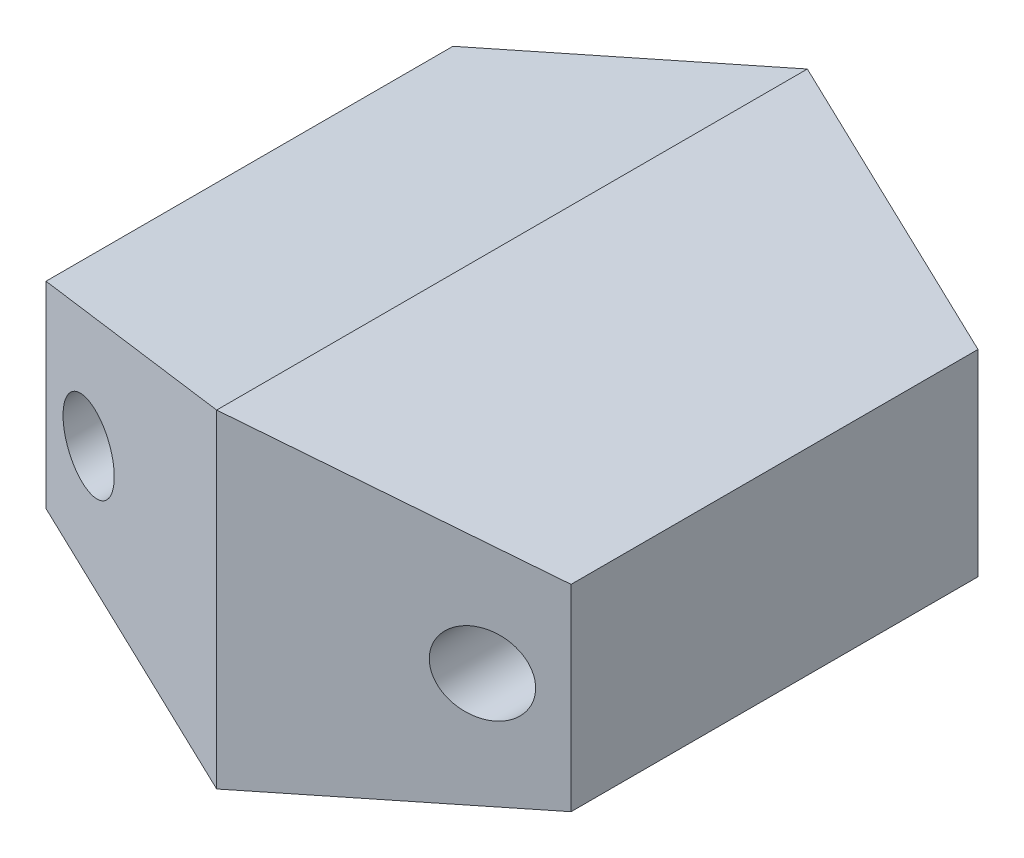
ISO-10303-21;
HEADER;
FILE_DESCRIPTION(('STEP AP214'),'2;1');
FILE_NAME('part.step','',(''),(''),'','','');
FILE_SCHEMA(('AUTOMOTIVE_DESIGN { 1 0 10303 214 1 1 1 1 }'));
ENDSEC;
DATA;
#1=APPLICATION_CONTEXT('core data for automotive mechanical design processes');
#2=APPLICATION_PROTOCOL_DEFINITION('international standard','automotive_design',2000,#1);
#3=PRODUCT_CONTEXT('',#1,'mechanical');
#4=PRODUCT('Part','Part','',(#3));
#5=PRODUCT_RELATED_PRODUCT_CATEGORY('part','',(#4));
#6=PRODUCT_DEFINITION_FORMATION('','',#4);
#7=PRODUCT_DEFINITION_CONTEXT('part definition',#1,'design');
#8=PRODUCT_DEFINITION('design','',#6,#7);
#9=PRODUCT_DEFINITION_SHAPE('','',#8);
#10=(LENGTH_UNIT() NAMED_UNIT(*) SI_UNIT(.MILLI.,.METRE.));
#11=(NAMED_UNIT(*) PLANE_ANGLE_UNIT() SI_UNIT($,.RADIAN.));
#12=(NAMED_UNIT(*) SI_UNIT($,.STERADIAN.) SOLID_ANGLE_UNIT());
#13=UNCERTAINTY_MEASURE_WITH_UNIT(LENGTH_MEASURE(1.E-05),#10,'distance_accuracy_value','');
#14=(GEOMETRIC_REPRESENTATION_CONTEXT(3) GLOBAL_UNCERTAINTY_ASSIGNED_CONTEXT((#13)) GLOBAL_UNIT_ASSIGNED_CONTEXT((#10,
#11,#12)) REPRESENTATION_CONTEXT('',''));
#15=CARTESIAN_POINT('',(0.,0.,0.));
#16=DIRECTION('',(0.,0.,1.));
#17=DIRECTION('',(1.,0.,0.));
#18=AXIS2_PLACEMENT_3D('',#15,#16,#17);
#19=CARTESIAN_POINT('',(20.,-12.5,45.));
#20=DIRECTION('',(-1.,0.,0.));
#21=DIRECTION('',(0.,0.,1.));
#22=AXIS2_PLACEMENT_3D('',#19,#20,#21);
#23=PLANE('',#22);
#24=DIRECTION('',(0.,0.,-1.));
#25=VECTOR('',#24,1.);
#26=CARTESIAN_POINT('',(20.0000000000001,7.4999999999998,45.));
#27=LINE('',#26,#25);
#28=CARTESIAN_POINT('',(20.0000000000001,7.4999999999998,38.));
#29=VERTEX_POINT('',#28);
#30=CARTESIAN_POINT('',(20.0000000000001,7.4999999999998,7.00000000000004));
#31=VERTEX_POINT('',#30);
#32=EDGE_CURVE('E147',#29,#31,#27,.T.);
#33=ORIENTED_EDGE('',*,*,#32,.F.);
#34=DIRECTION('',(0.,1.,0.));
#35=VECTOR('',#34,1.);
#36=CARTESIAN_POINT('',(20.,-32.5,38.));
#37=LINE('',#36,#35);
#38=CARTESIAN_POINT('',(20.0000000000001,-7.4999999999998,38.));
#39=VERTEX_POINT('',#38);
#40=EDGE_CURVE('E145',#39,#29,#37,.T.);
#41=ORIENTED_EDGE('',*,*,#40,.F.);
#42=DIRECTION('',(0.,0.,-1.));
#43=VECTOR('',#42,1.);
#44=CARTESIAN_POINT('',(20.0000000000001,-7.4999999999998,45.));
#45=LINE('',#44,#43);
#46=CARTESIAN_POINT('',(20.0000000000001,-7.4999999999998,7.00000000000004));
#47=VERTEX_POINT('',#46);
#48=EDGE_CURVE('E192',#39,#47,#45,.T.);
#49=ORIENTED_EDGE('',*,*,#48,.T.);
#50=DIRECTION('',(0.,1.,0.));
#51=VECTOR('',#50,1.);
#52=CARTESIAN_POINT('',(20.,-32.5,7.));
#53=LINE('',#52,#51);
#54=EDGE_CURVE('E216',#47,#31,#53,.T.);
#55=ORIENTED_EDGE('',*,*,#54,.T.);
#56=EDGE_LOOP('',(#33,#41,#49,#55));
#57=FACE_BOUND('',#56,.T.);
#58=ADVANCED_FACE('F74',(#57),#23,.F.);
#59=CARTESIAN_POINT('',(0.,-32.5,0.));
#60=DIRECTION('',(-0.330350424728106,0.,0.943858356366017));
#61=DIRECTION('',(0.943858356366017,0.,0.330350424728106));
#62=AXIS2_PLACEMENT_3D('',#59,#60,#61);
#63=PLANE('',#62);
#64=CARTESIAN_POINT('',(15.,0.,5.25000000000002));
#65=DIRECTION('',(-0.330350424728106,0.,0.943858356366017));
#66=DIRECTION('',(-0.943858356366018,0.,-0.330350424728106));
#67=AXIS2_PLACEMENT_3D('',#64,#65,#66);
#68=ELLIPSE('',#67,3.17844301506256,3.);
#69=CARTESIAN_POINT('',(12.,0.,4.20000000000002));
#70=VERTEX_POINT('',#69);
#71=EDGE_CURVE('E184',#70,#70,#68,.F.);
#72=ORIENTED_EDGE('',*,*,#71,.F.);
#73=EDGE_LOOP('',(#72));
#74=FACE_BOUND('',#73,.T.);
#75=DIRECTION('',(-0.918630424349249,0.229657606087321,-0.321520648522237));
#76=VECTOR('',#75,1.);
#77=CARTESIAN_POINT('',(9.49367088607626,10.1265822784809,3.32278481012669));
#78=LINE('',#77,#76);
#79=CARTESIAN_POINT('',(0.,12.5,0.));
#80=VERTEX_POINT('',#79);
#81=EDGE_CURVE('E99',#31,#80,#78,.T.);
#82=ORIENTED_EDGE('',*,*,#81,.F.);
#83=ORIENTED_EDGE('',*,*,#54,.F.);
#84=DIRECTION('',(-0.918630424349249,-0.229657606087321,-0.321520648522237));
#85=VECTOR('',#84,1.);
#86=CARTESIAN_POINT('',(-4.21940928270056,-13.5548523206752,-1.4767932489452));
#87=LINE('',#86,#85);
#88=CARTESIAN_POINT('',(0.,-12.5,0.));
#89=VERTEX_POINT('',#88);
#90=EDGE_CURVE('E203',#47,#89,#87,.T.);
#91=ORIENTED_EDGE('',*,*,#90,.T.);
#92=DIRECTION('',(0.,1.,0.));
#93=VECTOR('',#92,1.);
#94=CARTESIAN_POINT('',(0.,0.,0.));
#95=LINE('',#94,#93);
#96=EDGE_CURVE('E163',#89,#80,#95,.T.);
#97=ORIENTED_EDGE('',*,*,#96,.T.);
#98=EDGE_LOOP('',(#82,#83,#91,#97));
#99=FACE_BOUND('',#98,.T.);
#100=ADVANCED_FACE('F226',(#74,#99),#63,.F.);
#101=CARTESIAN_POINT('',(14.0311804008909,-32.5,40.0890868596882));
#102=DIRECTION('',(0.330350424728106,0.,0.943858356366017));
#103=DIRECTION('',(0.943858356366017,0.,-0.330350424728106));
#104=AXIS2_PLACEMENT_3D('',#101,#102,#103);
#105=PLANE('',#104);
#106=CARTESIAN_POINT('',(15.,0.,39.75));
#107=DIRECTION('',(0.330350424728106,0.,0.943858356366017));
#108=DIRECTION('',(0.943858356366018,0.,-0.330350424728106));
#109=AXIS2_PLACEMENT_3D('',#106,#107,#108);
#110=ELLIPSE('',#109,3.17844301506256,3.);
#111=CARTESIAN_POINT('',(18.,0.,38.7));
#112=VERTEX_POINT('',#111);
#113=EDGE_CURVE('E77',#112,#112,#110,.F.);
#114=ORIENTED_EDGE('',*,*,#113,.T.);
#115=EDGE_LOOP('',(#114));
#116=FACE_BOUND('',#115,.T.);
#117=ORIENTED_EDGE('',*,*,#40,.T.);
#118=DIRECTION('',(-0.918630424349249,0.229657606087321,0.321520648522237));
#119=VECTOR('',#118,1.);
#120=CARTESIAN_POINT('',(22.7848101265825,6.80379746835415,37.0253164556961));
#121=LINE('',#120,#119);
#122=CARTESIAN_POINT('',(0.,12.5,45.));
#123=VERTEX_POINT('',#122);
#124=EDGE_CURVE('E129',#29,#123,#121,.T.);
#125=ORIENTED_EDGE('',*,*,#124,.T.);
#126=DIRECTION('',(0.,-1.,0.));
#127=VECTOR('',#126,1.);
#128=CARTESIAN_POINT('',(0.,0.,45.));
#129=LINE('',#128,#127);
#130=CARTESIAN_POINT('',(0.,-12.5,45.));
#131=VERTEX_POINT('',#130);
#132=EDGE_CURVE('E143',#123,#131,#129,.T.);
#133=ORIENTED_EDGE('',*,*,#132,.T.);
#134=DIRECTION('',(-0.918630424349249,-0.229657606087321,0.321520648522237));
#135=VECTOR('',#134,1.);
#136=CARTESIAN_POINT('',(9.07172995780572,-10.2320675105485,41.824894514768));
#137=LINE('',#136,#135);
#138=EDGE_CURVE('E200',#39,#131,#137,.T.);
#139=ORIENTED_EDGE('',*,*,#138,.F.);
#140=EDGE_LOOP('',(#117,#125,#133,#139));
#141=FACE_BOUND('',#140,.T.);
#142=ADVANCED_FACE('F140',(#116,#141),#105,.T.);
#143=CARTESIAN_POINT('',(-20.,-12.5,45.));
#144=DIRECTION('',(1.,0.,0.));
#145=DIRECTION('',(0.,0.,-1.));
#146=AXIS2_PLACEMENT_3D('',#143,#144,#145);
#147=PLANE('',#146);
#148=DIRECTION('',(0.,1.,0.));
#149=VECTOR('',#148,1.);
#150=CARTESIAN_POINT('',(-20.,-32.5,38.));
#151=LINE('',#150,#149);
#152=CARTESIAN_POINT('',(-20.,-7.49999999999999,38.));
#153=VERTEX_POINT('',#152);
#154=CARTESIAN_POINT('',(-20.,7.5,38.));
#155=VERTEX_POINT('',#154);
#156=EDGE_CURVE('E213',#153,#155,#151,.T.);
#157=ORIENTED_EDGE('',*,*,#156,.T.);
#158=DIRECTION('',(0.,0.,-1.));
#159=VECTOR('',#158,1.);
#160=CARTESIAN_POINT('',(-20.,7.5,45.));
#161=LINE('',#160,#159);
#162=CARTESIAN_POINT('',(-20.,7.5,7.));
#163=VERTEX_POINT('',#162);
#164=EDGE_CURVE('E135',#155,#163,#161,.T.);
#165=ORIENTED_EDGE('',*,*,#164,.T.);
#166=DIRECTION('',(0.,1.,0.));
#167=VECTOR('',#166,1.);
#168=CARTESIAN_POINT('',(-20.,-32.5,7.));
#169=LINE('',#168,#167);
#170=CARTESIAN_POINT('',(-20.,-7.5,7.));
#171=VERTEX_POINT('',#170);
#172=EDGE_CURVE('E157',#171,#163,#169,.T.);
#173=ORIENTED_EDGE('',*,*,#172,.F.);
#174=DIRECTION('',(0.,0.,-1.));
#175=VECTOR('',#174,1.);
#176=CARTESIAN_POINT('',(-20.,-7.5,45.));
#177=LINE('',#176,#175);
#178=EDGE_CURVE('E91',#153,#171,#177,.T.);
#179=ORIENTED_EDGE('',*,*,#178,.F.);
#180=EDGE_LOOP('',(#157,#165,#173,#179));
#181=FACE_BOUND('',#180,.T.);
#182=ADVANCED_FACE('F232',(#181),#147,.F.);
#183=CARTESIAN_POINT('',(-14.0311804008909,-32.5,40.0890868596882));
#184=DIRECTION('',(0.330350424728106,0.,-0.943858356366017));
#185=DIRECTION('',(-0.943858356366017,0.,-0.330350424728106));
#186=AXIS2_PLACEMENT_3D('',#183,#184,#185);
#187=PLANE('',#186);
#188=CARTESIAN_POINT('',(-15.,0.,39.75));
#189=DIRECTION('',(0.330350424728106,0.,-0.943858356366017));
#190=DIRECTION('',(-0.943858356366018,0.,-0.330350424728106));
#191=AXIS2_PLACEMENT_3D('',#188,#189,#190);
#192=ELLIPSE('',#191,3.17844301506257,3.);
#193=CARTESIAN_POINT('',(-18.,0.,38.7));
#194=VERTEX_POINT('',#193);
#195=EDGE_CURVE('E174',#194,#194,#192,.F.);
#196=ORIENTED_EDGE('',*,*,#195,.F.);
#197=EDGE_LOOP('',(#196));
#198=FACE_BOUND('',#197,.T.);
#199=ORIENTED_EDGE('',*,*,#132,.F.);
#200=DIRECTION('',(-0.918630424349251,-0.229657606087312,-0.321520648522238));
#201=VECTOR('',#200,1.);
#202=CARTESIAN_POINT('',(-22.7848101265823,6.80379746835443,37.0253164556962));
#203=LINE('',#202,#201);
#204=EDGE_CURVE('E150',#123,#155,#203,.T.);
#205=ORIENTED_EDGE('',*,*,#204,.T.);
#206=ORIENTED_EDGE('',*,*,#156,.F.);
#207=DIRECTION('',(-0.918630424349251,0.229657606087312,-0.321520648522238));
#208=VECTOR('',#207,1.);
#209=CARTESIAN_POINT('',(-9.07172995780591,-10.2320675105485,41.824894514768));
#210=LINE('',#209,#208);
#211=EDGE_CURVE('E158',#131,#153,#210,.T.);
#212=ORIENTED_EDGE('',*,*,#211,.F.);
#213=EDGE_LOOP('',(#199,#205,#206,#212));
#214=FACE_BOUND('',#213,.T.);
#215=ADVANCED_FACE('F161',(#198,#214),#187,.F.);
#216=CARTESIAN_POINT('',(0.,-32.5,0.));
#217=DIRECTION('',(-0.330350424728106,0.,-0.943858356366017));
#218=DIRECTION('',(-0.943858356366017,0.,0.330350424728106));
#219=AXIS2_PLACEMENT_3D('',#216,#217,#218);
#220=PLANE('',#219);
#221=CARTESIAN_POINT('',(-15.,0.,5.25));
#222=DIRECTION('',(-0.330350424728106,0.,-0.943858356366017));
#223=DIRECTION('',(0.943858356366018,0.,-0.330350424728106));
#224=AXIS2_PLACEMENT_3D('',#221,#222,#223);
#225=ELLIPSE('',#224,3.17844301506257,3.);
#226=CARTESIAN_POINT('',(-12.,0.,4.2));
#227=VERTEX_POINT('',#226);
#228=EDGE_CURVE('E171',#227,#227,#225,.F.);
#229=ORIENTED_EDGE('',*,*,#228,.T.);
#230=EDGE_LOOP('',(#229));
#231=FACE_BOUND('',#230,.T.);
#232=DIRECTION('',(-0.918630424349251,-0.229657606087312,0.321520648522238));
#233=VECTOR('',#232,1.);
#234=CARTESIAN_POINT('',(-9.49367088607594,10.126582278481,3.32278481012658));
#235=LINE('',#234,#233);
#236=EDGE_CURVE('E12',#80,#163,#235,.T.);
#237=ORIENTED_EDGE('',*,*,#236,.F.);
#238=ORIENTED_EDGE('',*,*,#96,.F.);
#239=DIRECTION('',(-0.918630424349251,0.229657606087312,0.321520648522238));
#240=VECTOR('',#239,1.);
#241=CARTESIAN_POINT('',(4.21940928270042,-13.5548523206751,-1.47679324894515));
#242=LINE('',#241,#240);
#243=EDGE_CURVE('E83',#89,#171,#242,.T.);
#244=ORIENTED_EDGE('',*,*,#243,.T.);
#245=ORIENTED_EDGE('',*,*,#172,.T.);
#246=EDGE_LOOP('',(#237,#238,#244,#245));
#247=FACE_BOUND('',#246,.T.);
#248=ADVANCED_FACE('F229',(#231,#247),#220,.T.);
#249=CARTESIAN_POINT('',(-2.94117647058823,-11.7647058823529,45.));
#250=DIRECTION('',(-0.242535625036333,-0.970142500145332,0.));
#251=DIRECTION('',(0.970142500145332,-0.242535625036333,0.));
#252=AXIS2_PLACEMENT_3D('',#249,#250,#251);
#253=PLANE('',#252);
#254=ORIENTED_EDGE('',*,*,#211,.T.);
#255=ORIENTED_EDGE('',*,*,#178,.T.);
#256=ORIENTED_EDGE('',*,*,#243,.F.);
#257=DIRECTION('',(0.,0.,-1.));
#258=VECTOR('',#257,1.);
#259=CARTESIAN_POINT('',(0.,-12.5,45.));
#260=LINE('',#259,#258);
#261=EDGE_CURVE('E189',#131,#89,#260,.T.);
#262=ORIENTED_EDGE('',*,*,#261,.F.);
#263=EDGE_LOOP('',(#254,#255,#256,#262));
#264=FACE_BOUND('',#263,.T.);
#265=ADVANCED_FACE('F256',(#264),#253,.T.);
#266=CARTESIAN_POINT('',(-2.94117647058823,11.7647058823529,45.));
#267=DIRECTION('',(0.242535625036333,-0.970142500145332,0.));
#268=DIRECTION('',(0.970142500145332,0.242535625036333,0.));
#269=AXIS2_PLACEMENT_3D('',#266,#267,#268);
#270=PLANE('',#269);
#271=DIRECTION('',(0.,0.,-1.));
#272=VECTOR('',#271,1.);
#273=CARTESIAN_POINT('',(0.,12.5,45.));
#274=LINE('',#273,#272);
#275=EDGE_CURVE('E126',#123,#80,#274,.T.);
#276=ORIENTED_EDGE('',*,*,#275,.T.);
#277=ORIENTED_EDGE('',*,*,#236,.T.);
#278=ORIENTED_EDGE('',*,*,#164,.F.);
#279=ORIENTED_EDGE('',*,*,#204,.F.);
#280=EDGE_LOOP('',(#276,#277,#278,#279));
#281=FACE_BOUND('',#280,.T.);
#282=ADVANCED_FACE('F151',(#281),#270,.F.);
#283=CARTESIAN_POINT('',(2.94117647058833,11.7647058823529,45.));
#284=DIRECTION('',(0.242535625036341,0.97014250014533,0.));
#285=DIRECTION('',(-0.97014250014533,0.242535625036341,0.));
#286=AXIS2_PLACEMENT_3D('',#283,#284,#285);
#287=PLANE('',#286);
#288=ORIENTED_EDGE('',*,*,#81,.T.);
#289=ORIENTED_EDGE('',*,*,#275,.F.);
#290=ORIENTED_EDGE('',*,*,#124,.F.);
#291=ORIENTED_EDGE('',*,*,#32,.T.);
#292=EDGE_LOOP('',(#288,#289,#290,#291));
#293=FACE_BOUND('',#292,.T.);
#294=ADVANCED_FACE('F128',(#293),#287,.T.);
#295=CARTESIAN_POINT('',(2.94117647058833,-11.7647058823529,45.));
#296=DIRECTION('',(-0.242535625036341,0.97014250014533,0.));
#297=DIRECTION('',(-0.97014250014533,-0.242535625036341,0.));
#298=AXIS2_PLACEMENT_3D('',#295,#296,#297);
#299=PLANE('',#298);
#300=ORIENTED_EDGE('',*,*,#48,.F.);
#301=ORIENTED_EDGE('',*,*,#138,.T.);
#302=ORIENTED_EDGE('',*,*,#261,.T.);
#303=ORIENTED_EDGE('',*,*,#90,.F.);
#304=EDGE_LOOP('',(#300,#301,#302,#303));
#305=FACE_BOUND('',#304,.T.);
#306=ADVANCED_FACE('F262',(#305),#299,.F.);
#307=CARTESIAN_POINT('',(-15.,0.,45.));
#308=DIRECTION('',(0.,0.,-1.));
#309=DIRECTION('',(-1.,0.,0.));
#310=AXIS2_PLACEMENT_3D('',#307,#308,#309);
#311=CYLINDRICAL_SURFACE('',#310,3.);
#312=ORIENTED_EDGE('',*,*,#228,.F.);
#313=EDGE_LOOP('',(#312));
#314=FACE_BOUND('',#313,.T.);
#315=ORIENTED_EDGE('',*,*,#195,.T.);
#316=EDGE_LOOP('',(#315));
#317=FACE_BOUND('',#316,.T.);
#318=ADVANCED_FACE('F265',(#314,#317),#311,.F.);
#319=CARTESIAN_POINT('',(15.,0.,45.));
#320=DIRECTION('',(0.,0.,-1.));
#321=DIRECTION('',(-1.,0.,0.));
#322=AXIS2_PLACEMENT_3D('',#319,#320,#321);
#323=CYLINDRICAL_SURFACE('',#322,3.);
#324=ORIENTED_EDGE('',*,*,#113,.F.);
#325=EDGE_LOOP('',(#324));
#326=FACE_BOUND('',#325,.T.);
#327=ORIENTED_EDGE('',*,*,#71,.T.);
#328=EDGE_LOOP('',(#327));
#329=FACE_BOUND('',#328,.T.);
#330=ADVANCED_FACE('F269',(#326,#329),#323,.F.);
#331=CLOSED_SHELL('',(#58,#100,#142,#182,#215,#248,#265,#282,#294,#306,#318,#330));
#332=MANIFOLD_SOLID_BREP('B2',#331);
#333=ADVANCED_BREP_SHAPE_REPRESENTATION('',(#18,#332),#14);
#334=SHAPE_DEFINITION_REPRESENTATION(#9,#333);
ENDSEC;
END-ISO-10303-21;
